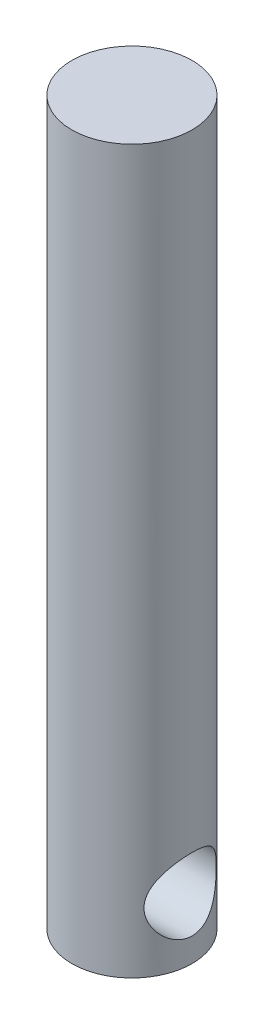
ISO-10303-21;
HEADER;
FILE_DESCRIPTION(('STEP AP214'),'2;1');
FILE_NAME('part.step','',(''),(''),'','','');
FILE_SCHEMA(('AUTOMOTIVE_DESIGN { 1 0 10303 214 1 1 1 1 }'));
ENDSEC;
DATA;
#1=APPLICATION_CONTEXT('core data for automotive mechanical design processes');
#2=APPLICATION_PROTOCOL_DEFINITION('international standard','automotive_design',2000,#1);
#3=PRODUCT_CONTEXT('',#1,'mechanical');
#4=PRODUCT('Part','Part','',(#3));
#5=PRODUCT_RELATED_PRODUCT_CATEGORY('part','',(#4));
#6=PRODUCT_DEFINITION_FORMATION('','',#4);
#7=PRODUCT_DEFINITION_CONTEXT('part definition',#1,'design');
#8=PRODUCT_DEFINITION('design','',#6,#7);
#9=PRODUCT_DEFINITION_SHAPE('','',#8);
#10=(LENGTH_UNIT() NAMED_UNIT(*) SI_UNIT(.MILLI.,.METRE.));
#11=(NAMED_UNIT(*) PLANE_ANGLE_UNIT() SI_UNIT($,.RADIAN.));
#12=(NAMED_UNIT(*) SI_UNIT($,.STERADIAN.) SOLID_ANGLE_UNIT());
#13=UNCERTAINTY_MEASURE_WITH_UNIT(LENGTH_MEASURE(1.E-05),#10,'distance_accuracy_value','');
#14=(GEOMETRIC_REPRESENTATION_CONTEXT(3) GLOBAL_UNCERTAINTY_ASSIGNED_CONTEXT((#13)) GLOBAL_UNIT_ASSIGNED_CONTEXT((#10,
#11,#12)) REPRESENTATION_CONTEXT('',''));
#15=CARTESIAN_POINT('',(0.,0.,0.));
#16=DIRECTION('',(0.,0.,1.));
#17=DIRECTION('',(1.,0.,0.));
#18=AXIS2_PLACEMENT_3D('',#15,#16,#17);
#19=CARTESIAN_POINT('',(0.,30.,0.));
#20=DIRECTION('',(0.,-1.,0.));
#21=DIRECTION('',(0.,0.,-1.));
#22=AXIS2_PLACEMENT_3D('',#19,#20,#21);
#23=CYLINDRICAL_SURFACE('',#22,2.5);
#24=CARTESIAN_POINT('',(-2.5,0.999999999999999,0.));
#25=CARTESIAN_POINT('',(-2.49999625789732,1.00000409100988,-0.0767298334620158));
#26=CARTESIAN_POINT('',(-2.4964290461501,1.00592867092626,-0.153582320644178));
#27=CARTESIAN_POINT('',(-2.48249903608568,1.02932431951533,-0.304975509530679));
#28=CARTESIAN_POINT('',(-2.47211948032719,1.04682386185422,-0.379510034596047));
#29=CARTESIAN_POINT('',(-2.44561558054488,1.09238636116686,-0.523751827790837));
#30=CARTESIAN_POINT('',(-2.42951973272944,1.12039695816316,-0.593481028226566));
#31=CARTESIAN_POINT('',(-2.39295367626407,1.18586033314103,-0.727030318214659));
#32=CARTESIAN_POINT('',(-2.37248455380255,1.22331076696874,-0.790851869416383));
#33=CARTESIAN_POINT('',(-2.32705360719088,1.30977482670858,-0.916299278999315));
#34=CARTESIAN_POINT('',(-2.30186792195985,1.35945369535139,-0.977384020081415));
#35=CARTESIAN_POINT('',(-2.25030439279634,1.46746720382827,-1.09088270411891));
#36=CARTESIAN_POINT('',(-2.22392505153571,1.52581293718732,-1.14328534948112));
#37=CARTESIAN_POINT('',(-2.1691106699591,1.65792351049673,-1.24444996762974));
#38=CARTESIAN_POINT('',(-2.14082017703649,1.73270177098129,-1.29197766378809));
#39=CARTESIAN_POINT('',(-2.08938301412124,1.89084657324311,-1.37361437764896));
#40=CARTESIAN_POINT('',(-2.06622802273937,1.97419889624757,-1.4077451733516));
#41=CARTESIAN_POINT('',(-2.0335462966093,2.12659645065324,-1.45440601714222));
#42=CARTESIAN_POINT('',(-2.02207883137591,2.19423599861032,-1.47016197246827));
#43=CARTESIAN_POINT('',(-2.00590308295503,2.33180371583036,-1.49216172340475));
#44=CARTESIAN_POINT('',(-2.00118639643759,2.40172892875449,-1.49841734556836));
#45=CARTESIAN_POINT('',(-1.99920922463856,2.54201149421733,-1.50105508796009));
#46=CARTESIAN_POINT('',(-2.00196337012718,2.6123694250932,-1.49741783408419));
#47=CARTESIAN_POINT('',(-2.01453261443741,2.75127877542759,-1.48046060478828));
#48=CARTESIAN_POINT('',(-2.02435302432226,2.81982879584744,-1.46713334620103));
#49=CARTESIAN_POINT('',(-2.04953186944258,2.9525302421281,-1.43173921881792));
#50=CARTESIAN_POINT('',(-2.06481711652537,3.01672705392448,-1.40978748666087));
#51=CARTESIAN_POINT('',(-2.09927051350828,3.14069499092812,-1.35795061770837));
#52=CARTESIAN_POINT('',(-2.11844008623465,3.20046448342392,-1.32806257259705));
#53=CARTESIAN_POINT('',(-2.16255327268985,3.3249840971228,-1.25517983184583));
#54=CARTESIAN_POINT('',(-2.18792043372992,3.38877809295493,-1.21080724397723));
#55=CARTESIAN_POINT('',(-2.23930599764381,3.50867648366701,-1.11291092784003));
#56=CARTESIAN_POINT('',(-2.26532500262149,3.56477343397651,-1.05937845100579));
#57=CARTESIAN_POINT('',(-2.31935504958317,3.67561298182176,-0.935811834382968));
#58=CARTESIAN_POINT('',(-2.34713836268532,3.72907730601599,-0.864517682704959));
#59=CARTESIAN_POINT('',(-2.3977242843398,3.82312204719791,-0.712276050459002));
#60=CARTESIAN_POINT('',(-2.42052955425515,3.86370935378995,-0.631333763943566));
#61=CARTESIAN_POINT('',(-2.45730392066151,3.9279321827959,-0.467197585268209));
#62=CARTESIAN_POINT('',(-2.47173957439704,3.95247535571591,-0.384467624173582));
#63=CARTESIAN_POINT('',(-2.4921884281355,3.98701119740538,-0.215047895144642));
#64=CARTESIAN_POINT('',(-2.49821172952738,3.99702131775358,-0.128363005661321));
#65=CARTESIAN_POINT('',(-2.5009057037461,4.00150784767831,0.0337146143773941));
#66=CARTESIAN_POINT('',(-2.49873521714286,3.99790885508517,0.109042473418716));
#67=CARTESIAN_POINT('',(-2.48778712087048,3.97957414692808,0.257829401986058));
#68=CARTESIAN_POINT('',(-2.47900964518037,3.96483865719419,0.331288509376104));
#69=CARTESIAN_POINT('',(-2.4559479244219,3.92545656718754,0.472574932157611));
#70=CARTESIAN_POINT('',(-2.44180275662555,3.90105965092653,0.540495750928482));
#71=CARTESIAN_POINT('',(-2.40913880862844,3.84332262363473,0.671265749087261));
#72=CARTESIAN_POINT('',(-2.39061916586511,3.80998074865333,0.734113924963907));
#73=CARTESIAN_POINT('',(-2.3484549623736,3.7314430207913,0.860006262823862));
#74=CARTESIAN_POINT('',(-2.3244780273988,3.68537617092161,0.922394150456836));
#75=CARTESIAN_POINT('',(-2.27474265574732,3.58460860651139,1.03902603131014));
#76=CARTESIAN_POINT('',(-2.2489821658636,3.52989784514747,1.09326040273738));
#77=CARTESIAN_POINT('',(-2.19445423909891,3.40508960996285,1.19931996735579));
#78=CARTESIAN_POINT('',(-2.16573241746291,3.3339161145345,1.24991019630915));
#79=CARTESIAN_POINT('',(-2.1121618206671,3.1827839754318,1.33845238915667));
#80=CARTESIAN_POINT('',(-2.0873089799769,3.10283470610722,1.37641766769781));
#81=CARTESIAN_POINT('',(-2.04984909240519,2.95375697769331,1.43142578795776));
#82=CARTESIAN_POINT('',(-2.03575659328729,2.88601968764141,1.4512162533619));
#83=CARTESIAN_POINT('',(-2.01409605743544,2.7474679219199,1.48113663905972));
#84=CARTESIAN_POINT('',(-2.00651897642721,2.67665785567217,1.49127995297631));
#85=CARTESIAN_POINT('',(-1.99900446616267,2.53362305240297,1.50134130416631));
#86=CARTESIAN_POINT('',(-1.99909576445937,2.46139400931296,1.50122089107869));
#87=CARTESIAN_POINT('',(-2.0069771789285,2.31810556439054,1.49066472959328));
#88=CARTESIAN_POINT('',(-2.0147714813882,2.24704681991941,1.48022337215759));
#89=CARTESIAN_POINT('',(-2.0363318524298,2.11151158242781,1.45040174148913));
#90=CARTESIAN_POINT('',(-2.0497921180558,2.04688290569313,1.43147636845351));
#91=CARTESIAN_POINT('',(-2.08105501960151,1.92166274552579,1.38563242076993));
#92=CARTESIAN_POINT('',(-2.09885929040482,1.86107279303945,1.3587108358848));
#93=CARTESIAN_POINT('',(-2.14012990550916,1.73568014277922,1.29289245555733));
#94=CARTESIAN_POINT('',(-2.16404587582639,1.67165889614569,1.25279167675753));
#95=CARTESIAN_POINT('',(-2.21320127030768,1.55061992738271,1.16375698389085));
#96=CARTESIAN_POINT('',(-2.23844177205021,1.49360803784745,1.11481579607798));
#97=CARTESIAN_POINT('',(-2.29225690291476,1.37864905086833,1.00009777425734));
#98=CARTESIAN_POINT('',(-2.32070308663658,1.32206892510381,0.932876819313907));
#99=CARTESIAN_POINT('',(-2.37365428872367,1.22090214413669,0.788462434445592));
#100=CARTESIAN_POINT('',(-2.39815789310935,1.17631978801521,0.711265444501543));
#101=CARTESIAN_POINT('',(-2.43985578654394,1.10221419242626,0.551125230801457));
#102=CARTESIAN_POINT('',(-2.45725077479787,1.07227193507317,0.468430086957218));
#103=CARTESIAN_POINT('',(-2.48366273001246,1.02727530478902,0.297973306118812));
#104=CARTESIAN_POINT('',(-2.49271125871485,1.01216483214301,0.210232099648616));
#105=CARTESIAN_POINT('',(-2.49802001168187,1.00330254529134,0.101558096917538));
#106=CARTESIAN_POINT('',(-2.49876114656362,1.0020655826939,0.0812762590282788));
#107=CARTESIAN_POINT('',(-2.49975164517367,1.00041375362914,0.0406658206871127));
#108=CARTESIAN_POINT('',(-2.50000099184316,0.999998915679095,0.0203372186375696));
#109=CARTESIAN_POINT('',(-2.5,0.999999999999999,0.));
#110=B_SPLINE_CURVE_WITH_KNOTS('',3,(#24,#25,#26,#27,#28,#29,#30,#31,#32,#33,#34,#35,#36,#37,
#38,#39,#40,#41,#42,#43,#44,#45,#46,#47,#48,#49,#50,#51,#52,#53,#54,#55,#56,#57,#58,#59,#60,#61,
#62,#63,#64,#65,#66,#67,#68,#69,#70,#71,#72,#73,#74,#75,#76,#77,#78,#79,#80,#81,#82,#83,#84,#85,
#86,#87,#88,#89,#90,#91,#92,#93,#94,#95,#96,#97,#98,#99,#100,#101,#102,#103,#104,#105,#106,#107,
#108,#109),.UNSPECIFIED.,.T.,.F.,(4,2,2,2,2,2,2,2,2,2,2,2,2,2,2,2,2,2,2,2,2,2,2,2,2,2,2,2,2,2,2,
2,2,2,2,2,2,2,2,2,2,2,4),(0.,0.230102237548649,0.460772627520012,0.690308884600012,
0.919788197992275,1.16681590732473,1.414162579348,1.69183813189807,1.96906040692092,
2.17933829855633,2.38935420916578,2.59978170870726,2.81036753273872,3.01823267593207,
3.22617409809868,3.47046995225163,3.71500044803674,3.99360957884691,4.27206939275324,
4.53296790696559,4.79355286918236,5.01875602722426,5.24395461863455,5.46367785689772,
5.68344445659025,5.92601365818362,6.16886690081836,6.44336762428009,6.71757792616456,
6.93257787314692,7.14727888733318,7.36278425777433,7.57840681155725,7.78364098331142,
7.98895251523035,8.22578610052286,8.46281544370208,8.73854311775519,9.01436946031985,
9.28175654462677,9.54812832184448,9.60911473335177,9.67010326027641),.UNSPECIFIED.);
#111=CARTESIAN_POINT('',(-2.5,0.999999999999999,0.));
#112=VERTEX_POINT('',#111);
#113=EDGE_CURVE('E10',#112,#112,#110,.T.);
#114=ORIENTED_EDGE('',*,*,#113,.T.);
#115=EDGE_LOOP('',(#114));
#116=FACE_BOUND('',#115,.T.);
#117=CARTESIAN_POINT('',(2.,2.5,-1.5));
#118=CARTESIAN_POINT('',(1.99999416642511,2.42452102471036,-1.50000404108592));
#119=CARTESIAN_POINT('',(2.00433633903481,2.3490615659202,-1.49426852824014));
#120=CARTESIAN_POINT('',(2.02092590613883,2.20067609603778,-1.47174965152787));
#121=CARTESIAN_POINT('',(2.03318155043097,2.1277528126149,-1.45495475788936));
#122=CARTESIAN_POINT('',(2.0636233903473,1.98691635832272,-1.41143486335796));
#123=CARTESIAN_POINT('',(2.08176666183119,1.91897116196473,-1.3847815450315));
#124=CARTESIAN_POINT('',(2.12185904995836,1.78856254663208,-1.3225290928302));
#125=CARTESIAN_POINT('',(2.14380930122416,1.72610077030486,-1.28692729054694));
#126=CARTESIAN_POINT('',(2.19228594587542,1.60005098333592,-1.20271292747644));
#127=CARTESIAN_POINT('',(2.21904371037662,1.53725904287606,-1.15304179435289));
#128=CARTESIAN_POINT('',(2.2722622943106,1.42023523725825,-1.04426801309985));
#129=CARTESIAN_POINT('',(2.29872287517103,1.3660098483292,-0.985158296729614));
#130=CARTESIAN_POINT('',(2.35175567858734,1.2618661902903,-0.851442367411703));
#131=CARTESIAN_POINT('',(2.37803133577818,1.21304553633025,-0.775851995162549));
#132=CARTESIAN_POINT('',(2.42443786983179,1.12919027755557,-0.615654228271659));
#133=CARTESIAN_POINT('',(2.44457437988735,1.09414302587729,-0.531055196626331));
#134=CARTESIAN_POINT('',(2.4747098780044,1.04240407718735,-0.363771406742667));
#135=CARTESIAN_POINT('',(2.4854930393917,1.0242796390327,-0.281674698130916));
#136=CARTESIAN_POINT('',(2.49874939277545,1.00205719713688,-0.114970509382708));
#137=CARTESIAN_POINT('',(2.50123038813307,0.997946021999945,-0.0303654624001536));
#138=CARTESIAN_POINT('',(2.49783372711539,1.00361374734246,0.12763728373731));
#139=CARTESIAN_POINT('',(2.49295437513726,1.01173352616931,0.201123832865634));
#140=CARTESIAN_POINT('',(2.47707997553857,1.03847979564811,0.345464269151768));
#141=CARTESIAN_POINT('',(2.46608447529309,1.05710706390715,0.416317961051202));
#142=CARTESIAN_POINT('',(2.43884907201719,1.10416556270378,0.55405678046908));
#143=CARTESIAN_POINT('',(2.42257910450824,1.132653061139,0.620916491037618));
#144=CARTESIAN_POINT('',(2.38609637638748,1.19838461622554,0.748988660115611));
#145=CARTESIAN_POINT('',(2.36588259201812,1.23563094705901,0.810199646208011));
#146=CARTESIAN_POINT('',(2.32037925976362,1.32283909280445,0.9330742671432));
#147=CARTESIAN_POINT('',(2.2947718295215,1.37378831173574,0.993918663198194));
#148=CARTESIAN_POINT('',(2.24255554245601,1.48440411786017,1.10671465909275));
#149=CARTESIAN_POINT('',(2.21594536703375,1.54408250347451,1.1586540130834));
#150=CARTESIAN_POINT('',(2.16111075123946,1.67865340616355,1.25824837767417));
#151=CARTESIAN_POINT('',(2.13305661385124,1.75450757653946,1.30470933188632));
#152=CARTESIAN_POINT('',(2.08250879557267,1.91470623163661,1.38397217194232));
#153=CARTESIAN_POINT('',(2.0600049029882,1.99903471612564,1.41679921962189));
#154=CARTESIAN_POINT('',(2.02895865196731,2.15239363189535,1.46077497064843));
#155=CARTESIAN_POINT('',(2.01833888618315,2.22004063229664,1.47527903312665));
#156=CARTESIAN_POINT('',(2.00392150777558,2.35737361029948,1.49480872755284));
#157=CARTESIAN_POINT('',(2.00011596115116,2.42705712048456,1.49984538302907));
#158=CARTESIAN_POINT('',(1.99988914321323,2.56655168243571,1.50014781114183));
#159=CARTESIAN_POINT('',(2.00347810223984,2.63636277721521,1.49540004697659));
#160=CARTESIAN_POINT('',(2.01751520788652,2.77398734374856,1.47640290574941));
#161=CARTESIAN_POINT('',(2.02796877613213,2.84179919224025,1.4621460183014));
#162=CARTESIAN_POINT('',(2.054317683331,2.97371457947979,1.42488312618657));
#163=CARTESIAN_POINT('',(2.07020622092812,3.03782263653223,1.40188805257362));
#164=CARTESIAN_POINT('',(2.10571539417587,3.16147771573018,1.34796261057072));
#165=CARTESIAN_POINT('',(2.12533743689999,3.221023006366,1.31702924888212));
#166=CARTESIAN_POINT('',(2.17036819177736,3.34524008251225,1.24167439558512));
#167=CARTESIAN_POINT('',(2.19618239397369,3.40890083509657,1.19582663060303));
#168=CARTESIAN_POINT('',(2.2482175480362,3.52828548484946,1.09487395518701));
#169=CARTESIAN_POINT('',(2.27443886711455,3.58400169216912,1.03976018672402));
#170=CARTESIAN_POINT('',(2.32835625910913,3.69322400735043,0.913274837212767));
#171=CARTESIAN_POINT('',(2.3558007587587,3.74550072660584,0.840721108780191));
#172=CARTESIAN_POINT('',(2.40537639133459,3.83690277683666,0.686103100868019));
#173=CARTESIAN_POINT('',(2.4275110444941,3.87603682784092,0.604045176134702));
#174=CARTESIAN_POINT('',(2.46252280092775,3.93686820343137,0.438840232972138));
#175=CARTESIAN_POINT('',(2.47595588067329,3.95962622779111,0.356205963651258));
#176=CARTESIAN_POINT('',(2.494407389061,3.99071460284626,0.187383063890857));
#177=CARTESIAN_POINT('',(2.49943534582737,3.99906129071763,0.101198571781968));
#178=CARTESIAN_POINT('',(2.50040600461976,4.00067460858593,-0.0598120232009843));
#179=CARTESIAN_POINT('',(2.49747057186327,3.99580333456303,-0.134620583589707));
#180=CARTESIAN_POINT('',(2.48512948412095,3.97510617561839,-0.282148755978774));
#181=CARTESIAN_POINT('',(2.47572375706639,3.9592801686784,-0.354868344701914));
#182=CARTESIAN_POINT('',(2.45149427526962,3.91778042841622,-0.495145481978797));
#183=CARTESIAN_POINT('',(2.43675966858906,3.89226840387076,-0.56276703260883));
#184=CARTESIAN_POINT('',(2.40303337447155,3.83235940544525,-0.692781971999984));
#185=CARTESIAN_POINT('',(2.38404073252268,3.7979604391404,-0.755174184199832));
#186=CARTESIAN_POINT('',(2.3409343265938,3.71707480343124,-0.880263645295948));
#187=CARTESIAN_POINT('',(2.31648844639149,3.66968129098313,-0.94225869043994));
#188=CARTESIAN_POINT('',(2.26601907350661,3.56624696628228,-1.05789751536307));
#189=CARTESIAN_POINT('',(2.23999385274509,3.51019657439209,-1.11153190956916));
#190=CARTESIAN_POINT('',(2.18528165666204,3.3827144378223,-1.2159097535057));
#191=CARTESIAN_POINT('',(2.15667566270901,3.3102335138345,-1.26542406663368));
#192=CARTESIAN_POINT('',(2.10376464485145,3.15651514723346,-1.35156817210325));
#193=CARTESIAN_POINT('',(2.07945738811052,3.07528228601859,-1.38820466322661));
#194=CARTESIAN_POINT('',(2.0408000304796,2.9129357148628,-1.44437116535132));
#195=CARTESIAN_POINT('',(2.02577665830138,2.83240476403875,-1.46509526060187));
#196=CARTESIAN_POINT('',(2.00539032320036,2.66790260529632,-1.49289268240426));
#197=CARTESIAN_POINT('',(2.00000648744643,2.58393923424129,-1.49999550595837));
#198=CARTESIAN_POINT('',(2.,2.5,-1.5));
#199=B_SPLINE_CURVE_WITH_KNOTS('',3,(#117,#118,#119,#120,#121,#122,#123,#124,#125,#126,#127,
#128,#129,#130,#131,#132,#133,#134,#135,#136,#137,#138,#139,#140,#141,#142,#143,#144,#145,#146,
#147,#148,#149,#150,#151,#152,#153,#154,#155,#156,#157,#158,#159,#160,#161,#162,#163,#164,#165,
#166,#167,#168,#169,#170,#171,#172,#173,#174,#175,#176,#177,#178,#179,#180,#181,#182,#183,#184,
#185,#186,#187,#188,#189,#190,#191,#192,#193,#194,#195,#196,#197,#198),.UNSPECIFIED.,.T.,.F.,(4,
2,2,2,2,2,2,2,2,2,2,2,2,2,2,2,2,2,2,2,2,2,2,2,2,2,2,2,2,2,2,2,2,2,2,2,2,2,2,2,4),(0.,
0.226085249493392,0.45240657433077,0.677113624991876,0.901887762215932,1.15414462390001,
1.40659128601844,1.68630157736223,1.9657544327122,2.21853330858497,2.47107452602767,
2.69230130543182,2.91354445887945,3.13607155036377,3.35865648368878,3.60782810055849,
3.85733966656908,4.13576671140276,4.41367760154768,4.62276298054684,4.83160475643977,
5.04073566011182,5.25003193304128,5.45906724365495,5.66818149154661,5.91499438482003,
6.16204457978455,6.44121828011589,6.72020638384848,6.97891479383338,7.23732973022727,
7.461293218494,7.68525920139649,7.90563970188757,8.12606965394585,8.37042963549488,
8.61506198741955,8.89071695766605,9.16622832484806,9.41820120134355,9.66962780912278),.UNSPECIFIED.);
#200=CARTESIAN_POINT('',(2.,2.5,-1.5));
#201=VERTEX_POINT('',#200);
#202=EDGE_CURVE('E42',#201,#201,#199,.T.);
#203=ORIENTED_EDGE('',*,*,#202,.T.);
#204=EDGE_LOOP('',(#203));
#205=FACE_BOUND('',#204,.T.);
#206=CARTESIAN_POINT('',(0.,30.,0.));
#207=DIRECTION('',(0.,1.,0.));
#208=DIRECTION('',(0.,0.,1.));
#209=AXIS2_PLACEMENT_3D('',#206,#207,#208);
#210=CIRCLE('',#209,2.5);
#211=CARTESIAN_POINT('',(0.,30.,2.5));
#212=VERTEX_POINT('',#211);
#213=EDGE_CURVE('E46',#212,#212,#210,.T.);
#214=ORIENTED_EDGE('',*,*,#213,.F.);
#215=EDGE_LOOP('',(#214));
#216=FACE_BOUND('',#215,.T.);
#217=CARTESIAN_POINT('',(0.,0.,0.));
#218=DIRECTION('',(0.,1.,0.));
#219=DIRECTION('',(0.,0.,1.));
#220=AXIS2_PLACEMENT_3D('',#217,#218,#219);
#221=CIRCLE('',#220,2.5);
#222=CARTESIAN_POINT('',(0.,0.,2.5));
#223=VERTEX_POINT('',#222);
#224=EDGE_CURVE('E50',#223,#223,#221,.T.);
#225=ORIENTED_EDGE('',*,*,#224,.T.);
#226=EDGE_LOOP('',(#225));
#227=FACE_BOUND('',#226,.T.);
#228=ADVANCED_FACE('F31',(#116,#205,#216,#227),#23,.T.);
#229=CARTESIAN_POINT('',(0.,30.,0.));
#230=DIRECTION('',(0.,1.,0.));
#231=DIRECTION('',(0.,0.,1.));
#232=AXIS2_PLACEMENT_3D('',#229,#230,#231);
#233=PLANE('',#232);
#234=ORIENTED_EDGE('',*,*,#213,.T.);
#235=EDGE_LOOP('',(#234));
#236=FACE_BOUND('',#235,.T.);
#237=ADVANCED_FACE('F62',(#236),#233,.T.);
#238=CARTESIAN_POINT('',(0.,0.,0.));
#239=DIRECTION('',(0.,1.,0.));
#240=DIRECTION('',(0.,0.,1.));
#241=AXIS2_PLACEMENT_3D('',#238,#239,#240);
#242=PLANE('',#241);
#243=ORIENTED_EDGE('',*,*,#224,.F.);
#244=EDGE_LOOP('',(#243));
#245=FACE_BOUND('',#244,.T.);
#246=ADVANCED_FACE('F60',(#245),#242,.F.);
#247=CARTESIAN_POINT('',(-2.5,2.5,0.));
#248=DIRECTION('',(1.,0.,0.));
#249=DIRECTION('',(0.,0.,-1.));
#250=AXIS2_PLACEMENT_3D('',#247,#248,#249);
#251=CYLINDRICAL_SURFACE('',#250,1.5);
#252=ORIENTED_EDGE('',*,*,#202,.F.);
#253=EDGE_LOOP('',(#252));
#254=FACE_BOUND('',#253,.T.);
#255=ORIENTED_EDGE('',*,*,#113,.F.);
#256=EDGE_LOOP('',(#255));
#257=FACE_BOUND('',#256,.T.);
#258=ADVANCED_FACE('F56',(#254,#257),#251,.F.);
#259=CLOSED_SHELL('',(#228,#237,#246,#258));
#260=MANIFOLD_SOLID_BREP('B2',#259);
#261=ADVANCED_BREP_SHAPE_REPRESENTATION('',(#18,#260),#14);
#262=SHAPE_DEFINITION_REPRESENTATION(#9,#261);
ENDSEC;
END-ISO-10303-21;
